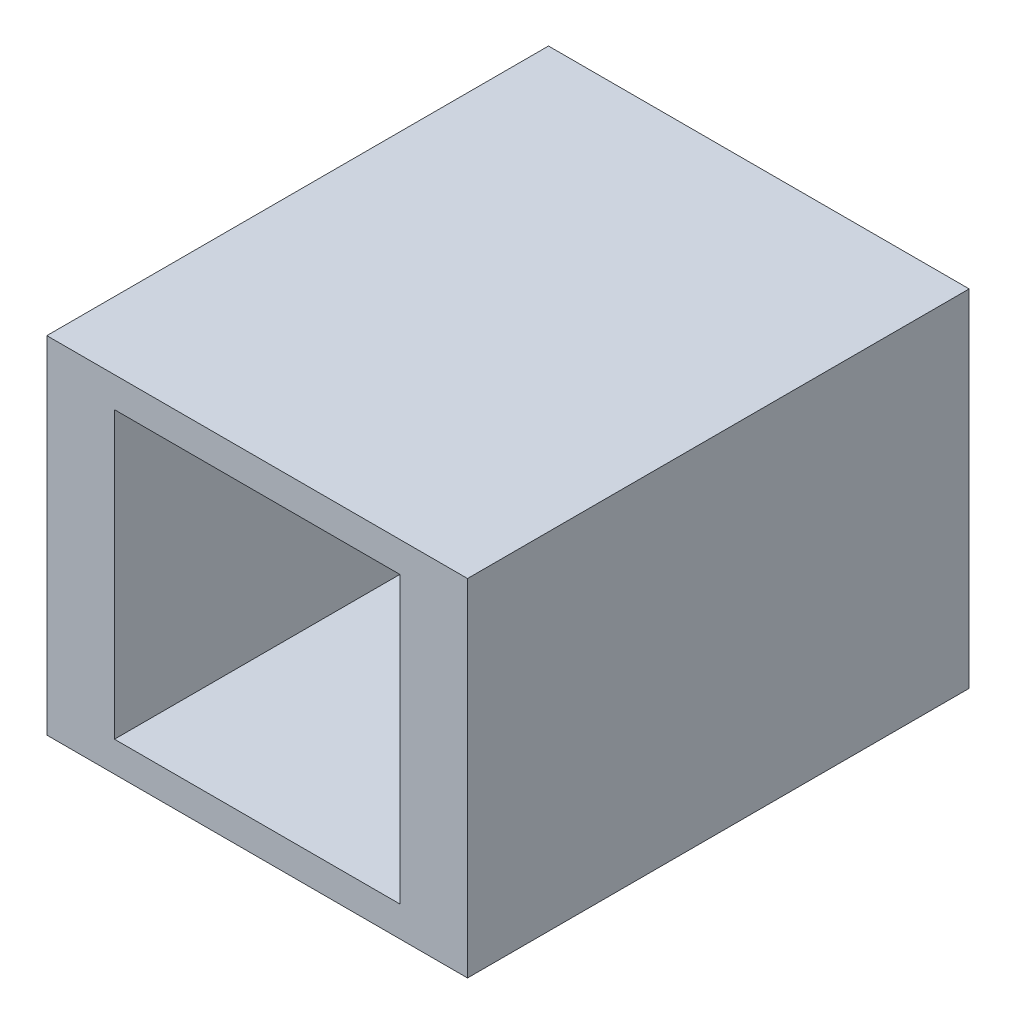
ISO-10303-21;
HEADER;
FILE_DESCRIPTION(('STEP AP214'),'2;1');
FILE_NAME('part.step','',(''),(''),'','','');
FILE_SCHEMA(('AUTOMOTIVE_DESIGN { 1 0 10303 214 1 1 1 1 }'));
ENDSEC;
DATA;
#1=APPLICATION_CONTEXT('core data for automotive mechanical design processes');
#2=APPLICATION_PROTOCOL_DEFINITION('international standard','automotive_design',2000,#1);
#3=PRODUCT_CONTEXT('',#1,'mechanical');
#4=PRODUCT('Part','Part','',(#3));
#5=PRODUCT_RELATED_PRODUCT_CATEGORY('part','',(#4));
#6=PRODUCT_DEFINITION_FORMATION('','',#4);
#7=PRODUCT_DEFINITION_CONTEXT('part definition',#1,'design');
#8=PRODUCT_DEFINITION('design','',#6,#7);
#9=PRODUCT_DEFINITION_SHAPE('','',#8);
#10=(LENGTH_UNIT() NAMED_UNIT(*) SI_UNIT(.MILLI.,.METRE.));
#11=(NAMED_UNIT(*) PLANE_ANGLE_UNIT() SI_UNIT($,.RADIAN.));
#12=(NAMED_UNIT(*) SI_UNIT($,.STERADIAN.) SOLID_ANGLE_UNIT());
#13=UNCERTAINTY_MEASURE_WITH_UNIT(LENGTH_MEASURE(1.E-05),#10,'distance_accuracy_value','');
#14=(GEOMETRIC_REPRESENTATION_CONTEXT(3) GLOBAL_UNCERTAINTY_ASSIGNED_CONTEXT((#13)) GLOBAL_UNIT_ASSIGNED_CONTEXT((#10,
#11,#12)) REPRESENTATION_CONTEXT('',''));
#15=CARTESIAN_POINT('',(0.,0.,0.));
#16=DIRECTION('',(0.,0.,1.));
#17=DIRECTION('',(1.,0.,0.));
#18=AXIS2_PLACEMENT_3D('',#15,#16,#17);
#19=CARTESIAN_POINT('',(0.,0.,29.));
#20=DIRECTION('',(0.,0.,1.));
#21=DIRECTION('',(1.,0.,0.));
#22=AXIS2_PLACEMENT_3D('',#19,#20,#21);
#23=PLANE('',#22);
#24=DIRECTION('',(0.,1.,0.));
#25=VECTOR('',#24,1.);
#26=CARTESIAN_POINT('',(12.16,10.,29.));
#27=LINE('',#26,#25);
#28=CARTESIAN_POINT('',(12.16,-10.,29.));
#29=VERTEX_POINT('',#28);
#30=CARTESIAN_POINT('',(12.16,10.,29.));
#31=VERTEX_POINT('',#30);
#32=EDGE_CURVE('E155',#29,#31,#27,.T.);
#33=ORIENTED_EDGE('',*,*,#32,.T.);
#34=DIRECTION('',(-1.,0.,0.));
#35=VECTOR('',#34,1.);
#36=CARTESIAN_POINT('',(-12.16,10.,29.));
#37=LINE('',#36,#35);
#38=CARTESIAN_POINT('',(-12.16,10.,29.));
#39=VERTEX_POINT('',#38);
#40=EDGE_CURVE('E159',#31,#39,#37,.T.);
#41=ORIENTED_EDGE('',*,*,#40,.T.);
#42=DIRECTION('',(0.,-1.,0.));
#43=VECTOR('',#42,1.);
#44=CARTESIAN_POINT('',(-12.16,10.,29.));
#45=LINE('',#44,#43);
#46=CARTESIAN_POINT('',(-12.16,-10.,29.));
#47=VERTEX_POINT('',#46);
#48=EDGE_CURVE('E163',#39,#47,#45,.T.);
#49=ORIENTED_EDGE('',*,*,#48,.T.);
#50=DIRECTION('',(1.,0.,0.));
#51=VECTOR('',#50,1.);
#52=CARTESIAN_POINT('',(-12.16,-10.,29.));
#53=LINE('',#52,#51);
#54=EDGE_CURVE('E166',#47,#29,#53,.T.);
#55=ORIENTED_EDGE('',*,*,#54,.T.);
#56=EDGE_LOOP('',(#33,#41,#49,#55));
#57=FACE_BOUND('',#56,.T.);
#58=DIRECTION('',(-1.,0.,0.));
#59=VECTOR('',#58,1.);
#60=CARTESIAN_POINT('',(-8.25,8.25,29.));
#61=LINE('',#60,#59);
#62=CARTESIAN_POINT('',(8.25,8.25,29.));
#63=VERTEX_POINT('',#62);
#64=CARTESIAN_POINT('',(-8.25,8.25,29.));
#65=VERTEX_POINT('',#64);
#66=EDGE_CURVE('E134',#63,#65,#61,.T.);
#67=ORIENTED_EDGE('',*,*,#66,.F.);
#68=DIRECTION('',(0.,1.,0.));
#69=VECTOR('',#68,1.);
#70=CARTESIAN_POINT('',(8.25,8.25,29.));
#71=LINE('',#70,#69);
#72=CARTESIAN_POINT('',(8.25,-8.25,29.));
#73=VERTEX_POINT('',#72);
#74=EDGE_CURVE('E130',#73,#63,#71,.T.);
#75=ORIENTED_EDGE('',*,*,#74,.F.);
#76=DIRECTION('',(1.,0.,0.));
#77=VECTOR('',#76,1.);
#78=CARTESIAN_POINT('',(-8.25,-8.25,29.));
#79=LINE('',#78,#77);
#80=CARTESIAN_POINT('',(-8.25,-8.25,29.));
#81=VERTEX_POINT('',#80);
#82=EDGE_CURVE('E115',#81,#73,#79,.T.);
#83=ORIENTED_EDGE('',*,*,#82,.F.);
#84=DIRECTION('',(0.,-1.,0.));
#85=VECTOR('',#84,1.);
#86=CARTESIAN_POINT('',(-8.25,8.25,29.));
#87=LINE('',#86,#85);
#88=EDGE_CURVE('E141',#65,#81,#87,.T.);
#89=ORIENTED_EDGE('',*,*,#88,.F.);
#90=EDGE_LOOP('',(#67,#75,#83,#89));
#91=FACE_BOUND('',#90,.T.);
#92=ADVANCED_FACE('F41',(#57,#91),#23,.T.);
#93=CARTESIAN_POINT('',(0.,0.,0.));
#94=DIRECTION('',(0.,0.,1.));
#95=DIRECTION('',(1.,0.,0.));
#96=AXIS2_PLACEMENT_3D('',#93,#94,#95);
#97=PLANE('',#96);
#98=DIRECTION('',(0.,1.,0.));
#99=VECTOR('',#98,1.);
#100=CARTESIAN_POINT('',(12.16,10.,0.));
#101=LINE('',#100,#99);
#102=CARTESIAN_POINT('',(12.16,-10.,0.));
#103=VERTEX_POINT('',#102);
#104=CARTESIAN_POINT('',(12.16,10.,0.));
#105=VERTEX_POINT('',#104);
#106=EDGE_CURVE('E154',#103,#105,#101,.T.);
#107=ORIENTED_EDGE('',*,*,#106,.F.);
#108=DIRECTION('',(1.,0.,0.));
#109=VECTOR('',#108,1.);
#110=CARTESIAN_POINT('',(-12.16,-10.,0.));
#111=LINE('',#110,#109);
#112=CARTESIAN_POINT('',(-12.16,-10.,0.));
#113=VERTEX_POINT('',#112);
#114=EDGE_CURVE('E160',#113,#103,#111,.T.);
#115=ORIENTED_EDGE('',*,*,#114,.F.);
#116=DIRECTION('',(0.,-1.,0.));
#117=VECTOR('',#116,1.);
#118=CARTESIAN_POINT('',(-12.16,10.,0.));
#119=LINE('',#118,#117);
#120=CARTESIAN_POINT('',(-12.16,10.,0.));
#121=VERTEX_POINT('',#120);
#122=EDGE_CURVE('E176',#121,#113,#119,.T.);
#123=ORIENTED_EDGE('',*,*,#122,.F.);
#124=DIRECTION('',(-1.,0.,0.));
#125=VECTOR('',#124,1.);
#126=CARTESIAN_POINT('',(-12.16,10.,0.));
#127=LINE('',#126,#125);
#128=EDGE_CURVE('E173',#105,#121,#127,.T.);
#129=ORIENTED_EDGE('',*,*,#128,.F.);
#130=EDGE_LOOP('',(#107,#115,#123,#129));
#131=FACE_BOUND('',#130,.T.);
#132=ADVANCED_FACE('F199',(#131),#97,.F.);
#133=CARTESIAN_POINT('',(12.16,10.,29.));
#134=DIRECTION('',(-1.,0.,0.));
#135=DIRECTION('',(0.,-1.,0.));
#136=AXIS2_PLACEMENT_3D('',#133,#134,#135);
#137=PLANE('',#136);
#138=ORIENTED_EDGE('',*,*,#106,.T.);
#139=DIRECTION('',(0.,0.,-1.));
#140=VECTOR('',#139,1.);
#141=CARTESIAN_POINT('',(12.16,10.,29.));
#142=LINE('',#141,#140);
#143=EDGE_CURVE('E11',#31,#105,#142,.T.);
#144=ORIENTED_EDGE('',*,*,#143,.F.);
#145=ORIENTED_EDGE('',*,*,#32,.F.);
#146=DIRECTION('',(0.,0.,-1.));
#147=VECTOR('',#146,1.);
#148=CARTESIAN_POINT('',(12.16,-10.,29.));
#149=LINE('',#148,#147);
#150=EDGE_CURVE('E169',#29,#103,#149,.T.);
#151=ORIENTED_EDGE('',*,*,#150,.T.);
#152=EDGE_LOOP('',(#138,#144,#145,#151));
#153=FACE_BOUND('',#152,.T.);
#154=ADVANCED_FACE('F43',(#153),#137,.F.);
#155=CARTESIAN_POINT('',(-12.16,10.,29.));
#156=DIRECTION('',(0.,-1.,0.));
#157=DIRECTION('',(0.,0.,-1.));
#158=AXIS2_PLACEMENT_3D('',#155,#156,#157);
#159=PLANE('',#158);
#160=ORIENTED_EDGE('',*,*,#128,.T.);
#161=DIRECTION('',(0.,0.,-1.));
#162=VECTOR('',#161,1.);
#163=CARTESIAN_POINT('',(-12.16,10.,29.));
#164=LINE('',#163,#162);
#165=EDGE_CURVE('E50',#39,#121,#164,.T.);
#166=ORIENTED_EDGE('',*,*,#165,.F.);
#167=ORIENTED_EDGE('',*,*,#40,.F.);
#168=ORIENTED_EDGE('',*,*,#143,.T.);
#169=EDGE_LOOP('',(#160,#166,#167,#168));
#170=FACE_BOUND('',#169,.T.);
#171=ADVANCED_FACE('F209',(#170),#159,.F.);
#172=CARTESIAN_POINT('',(-12.16,10.,29.));
#173=DIRECTION('',(1.,0.,0.));
#174=DIRECTION('',(0.,1.,0.));
#175=AXIS2_PLACEMENT_3D('',#172,#173,#174);
#176=PLANE('',#175);
#177=ORIENTED_EDGE('',*,*,#122,.T.);
#178=DIRECTION('',(0.,0.,-1.));
#179=VECTOR('',#178,1.);
#180=CARTESIAN_POINT('',(-12.16,-10.,29.));
#181=LINE('',#180,#179);
#182=EDGE_CURVE('E184',#47,#113,#181,.T.);
#183=ORIENTED_EDGE('',*,*,#182,.F.);
#184=ORIENTED_EDGE('',*,*,#48,.F.);
#185=ORIENTED_EDGE('',*,*,#165,.T.);
#186=EDGE_LOOP('',(#177,#183,#184,#185));
#187=FACE_BOUND('',#186,.T.);
#188=ADVANCED_FACE('F193',(#187),#176,.F.);
#189=CARTESIAN_POINT('',(-12.16,-10.,29.));
#190=DIRECTION('',(0.,1.,0.));
#191=DIRECTION('',(0.,0.,1.));
#192=AXIS2_PLACEMENT_3D('',#189,#190,#191);
#193=PLANE('',#192);
#194=ORIENTED_EDGE('',*,*,#114,.T.);
#195=ORIENTED_EDGE('',*,*,#150,.F.);
#196=ORIENTED_EDGE('',*,*,#54,.F.);
#197=ORIENTED_EDGE('',*,*,#182,.T.);
#198=EDGE_LOOP('',(#194,#195,#196,#197));
#199=FACE_BOUND('',#198,.T.);
#200=ADVANCED_FACE('F202',(#199),#193,.F.);
#201=CARTESIAN_POINT('',(8.25,8.25,29.));
#202=DIRECTION('',(-1.,0.,0.));
#203=DIRECTION('',(0.,-1.,0.));
#204=AXIS2_PLACEMENT_3D('',#201,#202,#203);
#205=PLANE('',#204);
#206=DIRECTION('',(0.,-1.,0.));
#207=VECTOR('',#206,1.);
#208=CARTESIAN_POINT('',(8.25,0.,1.));
#209=LINE('',#208,#207);
#210=CARTESIAN_POINT('',(8.25,8.25,1.00000000000001));
#211=VERTEX_POINT('',#210);
#212=CARTESIAN_POINT('',(8.25,-8.25,1.));
#213=VERTEX_POINT('',#212);
#214=EDGE_CURVE('E122',#211,#213,#209,.T.);
#215=ORIENTED_EDGE('',*,*,#214,.T.);
#216=DIRECTION('',(0.,0.,-1.));
#217=VECTOR('',#216,1.);
#218=CARTESIAN_POINT('',(8.25,-8.25,29.));
#219=LINE('',#218,#217);
#220=EDGE_CURVE('E109',#73,#213,#219,.T.);
#221=ORIENTED_EDGE('',*,*,#220,.F.);
#222=ORIENTED_EDGE('',*,*,#74,.T.);
#223=DIRECTION('',(0.,0.,-1.));
#224=VECTOR('',#223,1.);
#225=CARTESIAN_POINT('',(8.25,8.25,29.));
#226=LINE('',#225,#224);
#227=EDGE_CURVE('E124',#63,#211,#226,.T.);
#228=ORIENTED_EDGE('',*,*,#227,.T.);
#229=EDGE_LOOP('',(#215,#221,#222,#228));
#230=FACE_BOUND('',#229,.T.);
#231=ADVANCED_FACE('F123',(#230),#205,.T.);
#232=CARTESIAN_POINT('',(-8.25,8.25,29.));
#233=DIRECTION('',(0.,-1.,0.));
#234=DIRECTION('',(0.,0.,-1.));
#235=AXIS2_PLACEMENT_3D('',#232,#233,#234);
#236=PLANE('',#235);
#237=DIRECTION('',(1.,0.,0.));
#238=VECTOR('',#237,1.);
#239=CARTESIAN_POINT('',(0.,8.25,1.));
#240=LINE('',#239,#238);
#241=CARTESIAN_POINT('',(-8.25,8.25,1.00000000000001));
#242=VERTEX_POINT('',#241);
#243=EDGE_CURVE('E57',#242,#211,#240,.T.);
#244=ORIENTED_EDGE('',*,*,#243,.T.);
#245=ORIENTED_EDGE('',*,*,#227,.F.);
#246=ORIENTED_EDGE('',*,*,#66,.T.);
#247=DIRECTION('',(0.,0.,-1.));
#248=VECTOR('',#247,1.);
#249=CARTESIAN_POINT('',(-8.25,8.25,29.));
#250=LINE('',#249,#248);
#251=EDGE_CURVE('E149',#65,#242,#250,.T.);
#252=ORIENTED_EDGE('',*,*,#251,.T.);
#253=EDGE_LOOP('',(#244,#245,#246,#252));
#254=FACE_BOUND('',#253,.T.);
#255=ADVANCED_FACE('F229',(#254),#236,.T.);
#256=CARTESIAN_POINT('',(-8.25,8.25,29.));
#257=DIRECTION('',(1.,0.,0.));
#258=DIRECTION('',(0.,1.,0.));
#259=AXIS2_PLACEMENT_3D('',#256,#257,#258);
#260=PLANE('',#259);
#261=DIRECTION('',(0.,-1.,0.));
#262=VECTOR('',#261,1.);
#263=CARTESIAN_POINT('',(-8.25,0.,1.));
#264=LINE('',#263,#262);
#265=CARTESIAN_POINT('',(-8.25,-8.25,1.00000000000001));
#266=VERTEX_POINT('',#265);
#267=EDGE_CURVE('E65',#242,#266,#264,.T.);
#268=ORIENTED_EDGE('',*,*,#267,.F.);
#269=ORIENTED_EDGE('',*,*,#251,.F.);
#270=ORIENTED_EDGE('',*,*,#88,.T.);
#271=DIRECTION('',(0.,0.,-1.));
#272=VECTOR('',#271,1.);
#273=CARTESIAN_POINT('',(-8.25,-8.25,29.));
#274=LINE('',#273,#272);
#275=EDGE_CURVE('E119',#81,#266,#274,.T.);
#276=ORIENTED_EDGE('',*,*,#275,.T.);
#277=EDGE_LOOP('',(#268,#269,#270,#276));
#278=FACE_BOUND('',#277,.T.);
#279=ADVANCED_FACE('F233',(#278),#260,.T.);
#280=CARTESIAN_POINT('',(-8.25,-8.25,29.));
#281=DIRECTION('',(0.,1.,0.));
#282=DIRECTION('',(0.,0.,1.));
#283=AXIS2_PLACEMENT_3D('',#280,#281,#282);
#284=PLANE('',#283);
#285=DIRECTION('',(1.,0.,0.));
#286=VECTOR('',#285,1.);
#287=CARTESIAN_POINT('',(0.,-8.25,1.));
#288=LINE('',#287,#286);
#289=EDGE_CURVE('E113',#266,#213,#288,.T.);
#290=ORIENTED_EDGE('',*,*,#289,.F.);
#291=ORIENTED_EDGE('',*,*,#275,.F.);
#292=ORIENTED_EDGE('',*,*,#82,.T.);
#293=ORIENTED_EDGE('',*,*,#220,.T.);
#294=EDGE_LOOP('',(#290,#291,#292,#293));
#295=FACE_BOUND('',#294,.T.);
#296=ADVANCED_FACE('F111',(#295),#284,.T.);
#297=CARTESIAN_POINT('',(0.,0.,1.));
#298=DIRECTION('',(0.,0.,1.));
#299=DIRECTION('',(1.,0.,0.));
#300=AXIS2_PLACEMENT_3D('',#297,#298,#299);
#301=PLANE('',#300);
#302=ORIENTED_EDGE('',*,*,#214,.F.);
#303=ORIENTED_EDGE('',*,*,#243,.F.);
#304=ORIENTED_EDGE('',*,*,#267,.T.);
#305=ORIENTED_EDGE('',*,*,#289,.T.);
#306=EDGE_LOOP('',(#302,#303,#304,#305));
#307=FACE_BOUND('',#306,.T.);
#308=ADVANCED_FACE('F128',(#307),#301,.T.);
#309=CLOSED_SHELL('',(#92,#132,#154,#171,#188,#200,#231,#255,#279,#296,#308));
#310=MANIFOLD_SOLID_BREP('B2',#309);
#311=ADVANCED_BREP_SHAPE_REPRESENTATION('',(#18,#310),#14);
#312=SHAPE_DEFINITION_REPRESENTATION(#9,#311);
ENDSEC;
END-ISO-10303-21;
